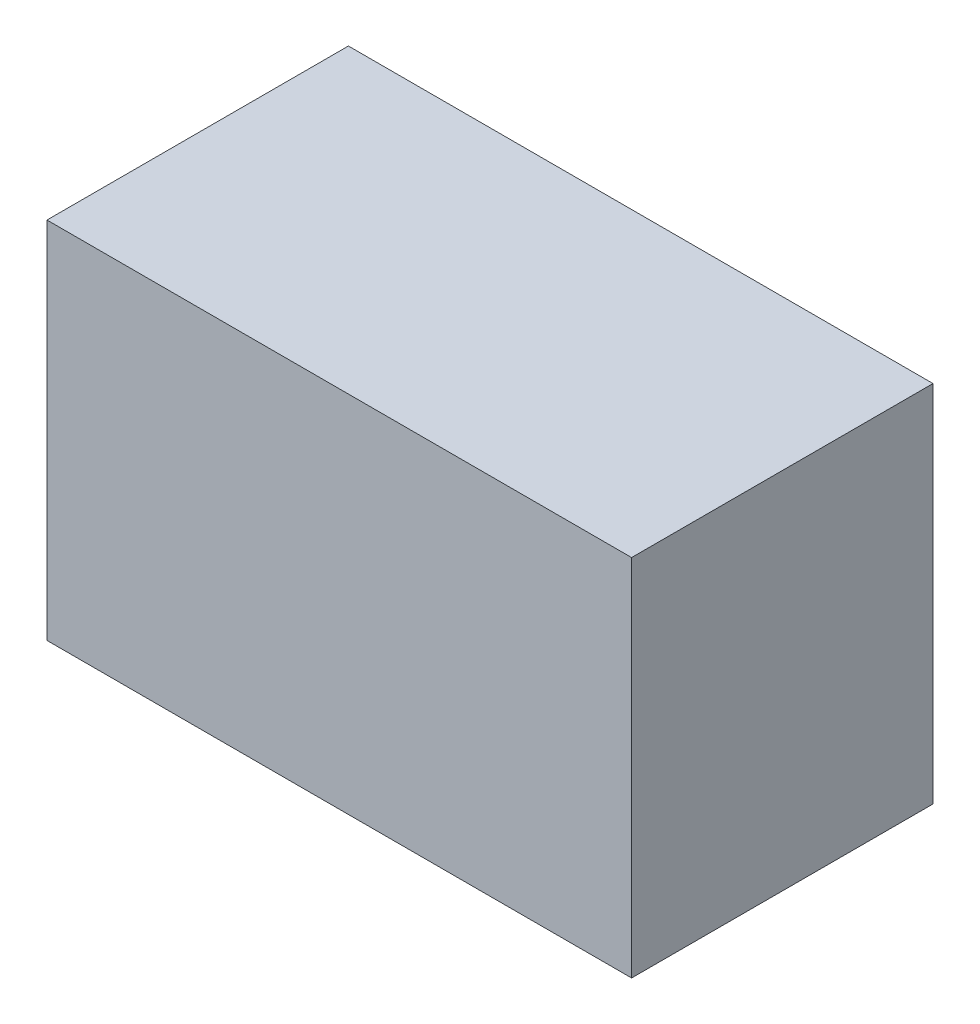
ISO-10303-21;
HEADER;
FILE_DESCRIPTION(('STEP AP214'),'2;1');
FILE_NAME('part.step','',(''),(''),'','','');
FILE_SCHEMA(('AUTOMOTIVE_DESIGN { 1 0 10303 214 1 1 1 1 }'));
ENDSEC;
DATA;
#1=APPLICATION_CONTEXT('core data for automotive mechanical design processes');
#2=APPLICATION_PROTOCOL_DEFINITION('international standard','automotive_design',2000,#1);
#3=PRODUCT_CONTEXT('',#1,'mechanical');
#4=PRODUCT('Part','Part','',(#3));
#5=PRODUCT_RELATED_PRODUCT_CATEGORY('part','',(#4));
#6=PRODUCT_DEFINITION_FORMATION('','',#4);
#7=PRODUCT_DEFINITION_CONTEXT('part definition',#1,'design');
#8=PRODUCT_DEFINITION('design','',#6,#7);
#9=PRODUCT_DEFINITION_SHAPE('','',#8);
#10=(LENGTH_UNIT() NAMED_UNIT(*) SI_UNIT(.MILLI.,.METRE.));
#11=(NAMED_UNIT(*) PLANE_ANGLE_UNIT() SI_UNIT($,.RADIAN.));
#12=(NAMED_UNIT(*) SI_UNIT($,.STERADIAN.) SOLID_ANGLE_UNIT());
#13=UNCERTAINTY_MEASURE_WITH_UNIT(LENGTH_MEASURE(1.E-05),#10,'distance_accuracy_value','');
#14=(GEOMETRIC_REPRESENTATION_CONTEXT(3) GLOBAL_UNCERTAINTY_ASSIGNED_CONTEXT((#13)) GLOBAL_UNIT_ASSIGNED_CONTEXT((#10,
#11,#12)) REPRESENTATION_CONTEXT('',''));
#15=CARTESIAN_POINT('',(0.,0.,0.));
#16=DIRECTION('',(0.,0.,1.));
#17=DIRECTION('',(1.,0.,0.));
#18=AXIS2_PLACEMENT_3D('',#15,#16,#17);
#19=CARTESIAN_POINT('',(144.5,-90.,149.));
#20=DIRECTION('',(-1.,0.,0.));
#21=DIRECTION('',(0.,0.,1.));
#22=AXIS2_PLACEMENT_3D('',#19,#20,#21);
#23=PLANE('',#22);
#24=DIRECTION('',(0.,1.,0.));
#25=VECTOR('',#24,1.);
#26=CARTESIAN_POINT('',(144.5,-90.,0.));
#27=LINE('',#26,#25);
#28=CARTESIAN_POINT('',(144.5,-90.,0.));
#29=VERTEX_POINT('',#28);
#30=CARTESIAN_POINT('',(144.5,90.,0.));
#31=VERTEX_POINT('',#30);
#32=EDGE_CURVE('E95',#29,#31,#27,.T.);
#33=ORIENTED_EDGE('',*,*,#32,.T.);
#34=DIRECTION('',(0.,0.,-1.));
#35=VECTOR('',#34,1.);
#36=CARTESIAN_POINT('',(144.5,90.,149.));
#37=LINE('',#36,#35);
#38=CARTESIAN_POINT('',(144.5,90.,149.));
#39=VERTEX_POINT('',#38);
#40=EDGE_CURVE('E11',#39,#31,#37,.T.);
#41=ORIENTED_EDGE('',*,*,#40,.F.);
#42=DIRECTION('',(0.,1.,0.));
#43=VECTOR('',#42,1.);
#44=CARTESIAN_POINT('',(144.5,-90.,149.));
#45=LINE('',#44,#43);
#46=CARTESIAN_POINT('',(144.5,-90.,149.));
#47=VERTEX_POINT('',#46);
#48=EDGE_CURVE('E83',#47,#39,#45,.T.);
#49=ORIENTED_EDGE('',*,*,#48,.F.);
#50=DIRECTION('',(0.,0.,-1.));
#51=VECTOR('',#50,1.);
#52=CARTESIAN_POINT('',(144.5,-90.,149.));
#53=LINE('',#52,#51);
#54=EDGE_CURVE('E91',#47,#29,#53,.T.);
#55=ORIENTED_EDGE('',*,*,#54,.T.);
#56=EDGE_LOOP('',(#33,#41,#49,#55));
#57=FACE_BOUND('',#56,.T.);
#58=ADVANCED_FACE('F32',(#57),#23,.F.);
#59=CARTESIAN_POINT('',(-144.5,90.,149.));
#60=DIRECTION('',(0.,-1.,0.));
#61=DIRECTION('',(0.,0.,-1.));
#62=AXIS2_PLACEMENT_3D('',#59,#60,#61);
#63=PLANE('',#62);
#64=DIRECTION('',(-1.,0.,0.));
#65=VECTOR('',#64,1.);
#66=CARTESIAN_POINT('',(-144.5,90.,0.));
#67=LINE('',#66,#65);
#68=CARTESIAN_POINT('',(-144.5,90.,0.));
#69=VERTEX_POINT('',#68);
#70=EDGE_CURVE('E87',#31,#69,#67,.T.);
#71=ORIENTED_EDGE('',*,*,#70,.T.);
#72=DIRECTION('',(0.,0.,-1.));
#73=VECTOR('',#72,1.);
#74=CARTESIAN_POINT('',(-144.5,90.,149.));
#75=LINE('',#74,#73);
#76=CARTESIAN_POINT('',(-144.5,90.,149.));
#77=VERTEX_POINT('',#76);
#78=EDGE_CURVE('E40',#77,#69,#75,.T.);
#79=ORIENTED_EDGE('',*,*,#78,.F.);
#80=DIRECTION('',(-1.,0.,0.));
#81=VECTOR('',#80,1.);
#82=CARTESIAN_POINT('',(-144.5,90.,149.));
#83=LINE('',#82,#81);
#84=EDGE_CURVE('E78',#39,#77,#83,.T.);
#85=ORIENTED_EDGE('',*,*,#84,.F.);
#86=ORIENTED_EDGE('',*,*,#40,.T.);
#87=EDGE_LOOP('',(#71,#79,#85,#86));
#88=FACE_BOUND('',#87,.T.);
#89=ADVANCED_FACE('F86',(#88),#63,.F.);
#90=CARTESIAN_POINT('',(-144.5,-90.,149.));
#91=DIRECTION('',(1.,0.,0.));
#92=DIRECTION('',(0.,0.,-1.));
#93=AXIS2_PLACEMENT_3D('',#90,#91,#92);
#94=PLANE('',#93);
#95=DIRECTION('',(0.,-1.,0.));
#96=VECTOR('',#95,1.);
#97=CARTESIAN_POINT('',(-144.5,-90.,0.));
#98=LINE('',#97,#96);
#99=CARTESIAN_POINT('',(-144.5,-90.,0.));
#100=VERTEX_POINT('',#99);
#101=EDGE_CURVE('E65',#69,#100,#98,.T.);
#102=ORIENTED_EDGE('',*,*,#101,.T.);
#103=DIRECTION('',(0.,0.,-1.));
#104=VECTOR('',#103,1.);
#105=CARTESIAN_POINT('',(-144.5,-90.,149.));
#106=LINE('',#105,#104);
#107=CARTESIAN_POINT('',(-144.5,-90.,149.));
#108=VERTEX_POINT('',#107);
#109=EDGE_CURVE('E88',#108,#100,#106,.T.);
#110=ORIENTED_EDGE('',*,*,#109,.F.);
#111=DIRECTION('',(0.,-1.,0.));
#112=VECTOR('',#111,1.);
#113=CARTESIAN_POINT('',(-144.5,-90.,149.));
#114=LINE('',#113,#112);
#115=EDGE_CURVE('E81',#77,#108,#114,.T.);
#116=ORIENTED_EDGE('',*,*,#115,.F.);
#117=ORIENTED_EDGE('',*,*,#78,.T.);
#118=EDGE_LOOP('',(#102,#110,#116,#117));
#119=FACE_BOUND('',#118,.T.);
#120=ADVANCED_FACE('F89',(#119),#94,.F.);
#121=CARTESIAN_POINT('',(-144.5,-90.,149.));
#122=DIRECTION('',(0.,1.,0.));
#123=DIRECTION('',(0.,0.,1.));
#124=AXIS2_PLACEMENT_3D('',#121,#122,#123);
#125=PLANE('',#124);
#126=DIRECTION('',(1.,0.,0.));
#127=VECTOR('',#126,1.);
#128=CARTESIAN_POINT('',(-144.5,-90.,0.));
#129=LINE('',#128,#127);
#130=EDGE_CURVE('E71',#100,#29,#129,.T.);
#131=ORIENTED_EDGE('',*,*,#130,.T.);
#132=ORIENTED_EDGE('',*,*,#54,.F.);
#133=DIRECTION('',(1.,0.,0.));
#134=VECTOR('',#133,1.);
#135=CARTESIAN_POINT('',(-144.5,-90.,149.));
#136=LINE('',#135,#134);
#137=EDGE_CURVE('E48',#108,#47,#136,.T.);
#138=ORIENTED_EDGE('',*,*,#137,.F.);
#139=ORIENTED_EDGE('',*,*,#109,.T.);
#140=EDGE_LOOP('',(#131,#132,#138,#139));
#141=FACE_BOUND('',#140,.T.);
#142=ADVANCED_FACE('F102',(#141),#125,.F.);
#143=CARTESIAN_POINT('',(0.,0.,149.));
#144=DIRECTION('',(0.,0.,-1.));
#145=DIRECTION('',(-1.,0.,0.));
#146=AXIS2_PLACEMENT_3D('',#143,#144,#145);
#147=PLANE('',#146);
#148=ORIENTED_EDGE('',*,*,#48,.T.);
#149=ORIENTED_EDGE('',*,*,#84,.T.);
#150=ORIENTED_EDGE('',*,*,#115,.T.);
#151=ORIENTED_EDGE('',*,*,#137,.T.);
#152=EDGE_LOOP('',(#148,#149,#150,#151));
#153=FACE_BOUND('',#152,.T.);
#154=ADVANCED_FACE('F79',(#153),#147,.F.);
#155=CARTESIAN_POINT('',(0.,0.,0.));
#156=DIRECTION('',(0.,0.,-1.));
#157=DIRECTION('',(-1.,0.,0.));
#158=AXIS2_PLACEMENT_3D('',#155,#156,#157);
#159=PLANE('',#158);
#160=ORIENTED_EDGE('',*,*,#32,.F.);
#161=ORIENTED_EDGE('',*,*,#130,.F.);
#162=ORIENTED_EDGE('',*,*,#101,.F.);
#163=ORIENTED_EDGE('',*,*,#70,.F.);
#164=EDGE_LOOP('',(#160,#161,#162,#163));
#165=FACE_BOUND('',#164,.T.);
#166=ADVANCED_FACE('F105',(#165),#159,.T.);
#167=CLOSED_SHELL('',(#58,#89,#120,#142,#154,#166));
#168=MANIFOLD_SOLID_BREP('B2',#167);
#169=ADVANCED_BREP_SHAPE_REPRESENTATION('',(#18,#168),#14);
#170=SHAPE_DEFINITION_REPRESENTATION(#9,#169);
ENDSEC;
END-ISO-10303-21;
